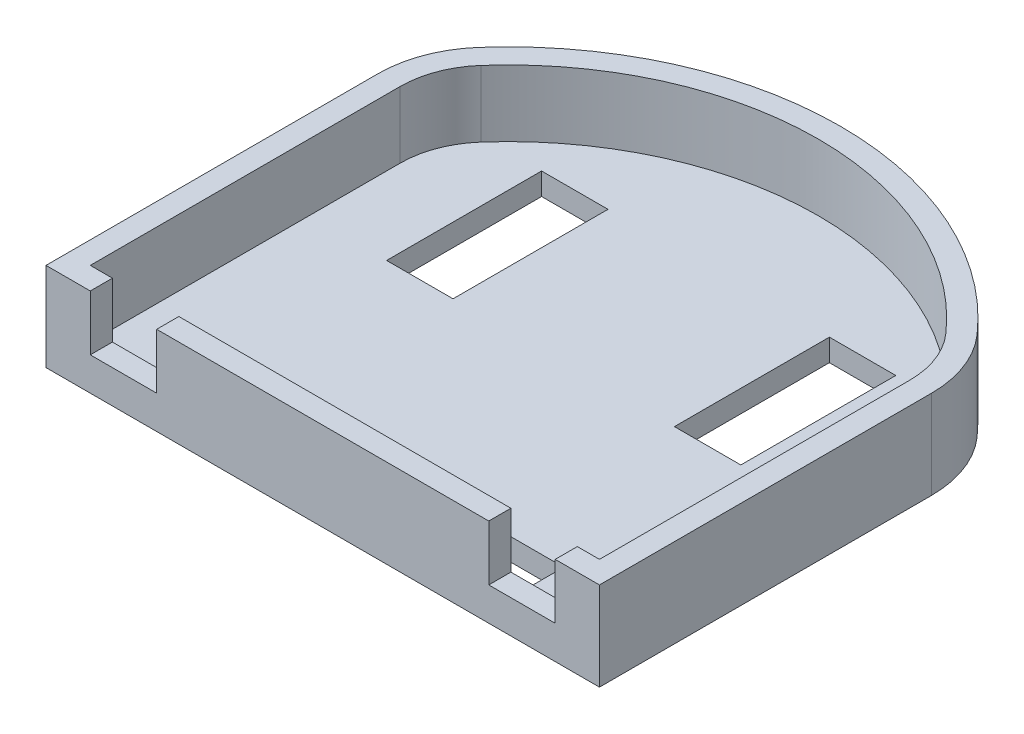
ISO-10303-21;
HEADER;
FILE_DESCRIPTION(('STEP AP214'),'2;1');
FILE_NAME('part.step','',(''),(''),'','','');
FILE_SCHEMA(('AUTOMOTIVE_DESIGN { 1 0 10303 214 1 1 1 1 }'));
ENDSEC;
DATA;
#1=APPLICATION_CONTEXT('core data for automotive mechanical design processes');
#2=APPLICATION_PROTOCOL_DEFINITION('international standard','automotive_design',2000,#1);
#3=PRODUCT_CONTEXT('',#1,'mechanical');
#4=PRODUCT('Part','Part','',(#3));
#5=PRODUCT_RELATED_PRODUCT_CATEGORY('part','',(#4));
#6=PRODUCT_DEFINITION_FORMATION('','',#4);
#7=PRODUCT_DEFINITION_CONTEXT('part definition',#1,'design');
#8=PRODUCT_DEFINITION('design','',#6,#7);
#9=PRODUCT_DEFINITION_SHAPE('','',#8);
#10=(LENGTH_UNIT() NAMED_UNIT(*) SI_UNIT(.MILLI.,.METRE.));
#11=(NAMED_UNIT(*) PLANE_ANGLE_UNIT() SI_UNIT($,.RADIAN.));
#12=(NAMED_UNIT(*) SI_UNIT($,.STERADIAN.) SOLID_ANGLE_UNIT());
#13=UNCERTAINTY_MEASURE_WITH_UNIT(LENGTH_MEASURE(1.E-05),#10,'distance_accuracy_value','');
#14=(GEOMETRIC_REPRESENTATION_CONTEXT(3) GLOBAL_UNCERTAINTY_ASSIGNED_CONTEXT((#13)) GLOBAL_UNIT_ASSIGNED_CONTEXT((#10,
#11,#12)) REPRESENTATION_CONTEXT('',''));
#15=CARTESIAN_POINT('',(0.,0.,0.));
#16=DIRECTION('',(0.,0.,1.));
#17=DIRECTION('',(1.,0.,0.));
#18=AXIS2_PLACEMENT_3D('',#15,#16,#17);
#19=CARTESIAN_POINT('',(75.,40.,-66.1437827766148));
#20=DIRECTION('',(0.,1.,0.));
#21=DIRECTION('',(0.,0.,1.));
#22=AXIS2_PLACEMENT_3D('',#19,#20,#21);
#23=PLANE('',#22);
#24=DIRECTION('',(0.,0.,-1.));
#25=VECTOR('',#24,1.);
#26=CARTESIAN_POINT('',(-105.,40.,-150.001));
#27=LINE('',#26,#25);
#28=CARTESIAN_POINT('',(-105.,40.,83.8562172233852));
#29=VERTEX_POINT('',#28);
#30=CARTESIAN_POINT('',(-105.,40.,73.8562172233852));
#31=VERTEX_POINT('',#30);
#32=EDGE_CURVE('E257',#29,#31,#27,.T.);
#33=ORIENTED_EDGE('',*,*,#32,.T.);
#34=DIRECTION('',(1.,0.,0.));
#35=VECTOR('',#34,1.);
#36=CARTESIAN_POINT('',(125.,40.,73.8562172233852));
#37=LINE('',#36,#35);
#38=CARTESIAN_POINT('',(-115.,40.,73.8562172233852));
#39=VERTEX_POINT('',#38);
#40=EDGE_CURVE('E271',#39,#31,#37,.T.);
#41=ORIENTED_EDGE('',*,*,#40,.F.);
#42=DIRECTION('',(0.,0.,1.));
#43=VECTOR('',#42,1.);
#44=CARTESIAN_POINT('',(-115.,40.,-66.1437827766147));
#45=LINE('',#44,#43);
#46=CARTESIAN_POINT('',(-115.,40.,-66.1437827766147));
#47=VERTEX_POINT('',#46);
#48=EDGE_CURVE('E294',#47,#39,#45,.T.);
#49=ORIENTED_EDGE('',*,*,#48,.F.);
#50=CARTESIAN_POINT('',(-75.,40.,-66.1437827766148));
#51=DIRECTION('',(0.,1.,0.));
#52=DIRECTION('',(0.,0.,1.));
#53=AXIS2_PLACEMENT_3D('',#50,#51,#52);
#54=CIRCLE('',#53,40.);
#55=CARTESIAN_POINT('',(-105.,40.,-92.6012958872606));
#56=VERTEX_POINT('',#55);
#57=EDGE_CURVE('E299',#56,#47,#54,.T.);
#58=ORIENTED_EDGE('',*,*,#57,.F.);
#59=CARTESIAN_POINT('',(0.,40.,0.));
#60=DIRECTION('',(0.,1.,0.));
#61=DIRECTION('',(0.,0.,1.));
#62=AXIS2_PLACEMENT_3D('',#59,#60,#61);
#63=CIRCLE('',#62,140.);
#64=CARTESIAN_POINT('',(105.,40.,-92.6012958872606));
#65=VERTEX_POINT('',#64);
#66=EDGE_CURVE('E303',#65,#56,#63,.T.);
#67=ORIENTED_EDGE('',*,*,#66,.F.);
#68=CARTESIAN_POINT('',(75.,40.,-66.1437827766148));
#69=DIRECTION('',(0.,1.,0.));
#70=DIRECTION('',(0.,0.,1.));
#71=AXIS2_PLACEMENT_3D('',#68,#69,#70);
#72=CIRCLE('',#71,40.);
#73=CARTESIAN_POINT('',(115.,40.,-66.1437827766148));
#74=VERTEX_POINT('',#73);
#75=EDGE_CURVE('E308',#74,#65,#72,.T.);
#76=ORIENTED_EDGE('',*,*,#75,.F.);
#77=DIRECTION('',(0.,0.,-1.));
#78=VECTOR('',#77,1.);
#79=CARTESIAN_POINT('',(115.,40.,-66.1437827766148));
#80=LINE('',#79,#78);
#81=CARTESIAN_POINT('',(115.,40.,73.8562172233852));
#82=VERTEX_POINT('',#81);
#83=EDGE_CURVE('E283',#82,#74,#80,.T.);
#84=ORIENTED_EDGE('',*,*,#83,.F.);
#85=CARTESIAN_POINT('',(105.,40.,73.8562172233852));
#86=VERTEX_POINT('',#85);
#87=EDGE_CURVE('E286',#86,#82,#37,.T.);
#88=ORIENTED_EDGE('',*,*,#87,.F.);
#89=DIRECTION('',(0.,0.,1.));
#90=VECTOR('',#89,1.);
#91=CARTESIAN_POINT('',(105.,40.,-150.001));
#92=LINE('',#91,#90);
#93=CARTESIAN_POINT('',(105.,40.,83.8562172233852));
#94=VERTEX_POINT('',#93);
#95=EDGE_CURVE('E58',#86,#94,#92,.T.);
#96=ORIENTED_EDGE('',*,*,#95,.T.);
#97=DIRECTION('',(1.,0.,0.));
#98=VECTOR('',#97,1.);
#99=CARTESIAN_POINT('',(125.,40.,83.8562172233852));
#100=LINE('',#99,#98);
#101=CARTESIAN_POINT('',(125.,40.,83.8562172233852));
#102=VERTEX_POINT('',#101);
#103=EDGE_CURVE('E549',#94,#102,#100,.T.);
#104=ORIENTED_EDGE('',*,*,#103,.T.);
#105=DIRECTION('',(0.,0.,-1.));
#106=VECTOR('',#105,1.);
#107=CARTESIAN_POINT('',(125.,40.,-66.1437827766148));
#108=LINE('',#107,#106);
#109=CARTESIAN_POINT('',(125.,40.,-66.1437827766148));
#110=VERTEX_POINT('',#109);
#111=EDGE_CURVE('E553',#102,#110,#108,.T.);
#112=ORIENTED_EDGE('',*,*,#111,.T.);
#113=CARTESIAN_POINT('',(75.,40.,-66.1437827766148));
#114=DIRECTION('',(0.,1.,0.));
#115=DIRECTION('',(0.,0.,1.));
#116=AXIS2_PLACEMENT_3D('',#113,#114,#115);
#117=CIRCLE('',#116,50.);
#118=CARTESIAN_POINT('',(112.5,40.,-99.2156741649221));
#119=VERTEX_POINT('',#118);
#120=EDGE_CURVE('E579',#110,#119,#117,.T.);
#121=ORIENTED_EDGE('',*,*,#120,.T.);
#122=CARTESIAN_POINT('',(0.,40.,0.));
#123=DIRECTION('',(0.,1.,0.));
#124=DIRECTION('',(0.,0.,1.));
#125=AXIS2_PLACEMENT_3D('',#122,#123,#124);
#126=CIRCLE('',#125,150.);
#127=CARTESIAN_POINT('',(-112.5,40.,-99.2156741649221));
#128=VERTEX_POINT('',#127);
#129=EDGE_CURVE('E661',#119,#128,#126,.T.);
#130=ORIENTED_EDGE('',*,*,#129,.T.);
#131=CARTESIAN_POINT('',(-75.,40.,-66.1437827766148));
#132=DIRECTION('',(0.,1.,0.));
#133=DIRECTION('',(0.,0.,-1.));
#134=AXIS2_PLACEMENT_3D('',#131,#132,#133);
#135=CIRCLE('',#134,50.);
#136=CARTESIAN_POINT('',(-125.,40.,-66.1437827766147));
#137=VERTEX_POINT('',#136);
#138=EDGE_CURVE('E602',#128,#137,#135,.T.);
#139=ORIENTED_EDGE('',*,*,#138,.T.);
#140=DIRECTION('',(0.,0.,1.));
#141=VECTOR('',#140,1.);
#142=CARTESIAN_POINT('',(-125.,40.,-66.1437827766147));
#143=LINE('',#142,#141);
#144=CARTESIAN_POINT('',(-125.,40.,83.8562172233852));
#145=VERTEX_POINT('',#144);
#146=EDGE_CURVE('E554',#137,#145,#143,.T.);
#147=ORIENTED_EDGE('',*,*,#146,.T.);
#148=EDGE_CURVE('E273',#145,#29,#100,.T.);
#149=ORIENTED_EDGE('',*,*,#148,.T.);
#150=EDGE_LOOP('',(#33,#41,#49,#58,#67,#76,#84,#88,#96,#104,#112,#121,#130,#139,#147,#149));
#151=FACE_BOUND('',#150,.T.);
#152=ADVANCED_FACE('F42',(#151),#23,.T.);
#153=CARTESIAN_POINT('',(75.,40.,-66.1437827766148));
#154=DIRECTION('',(0.,-1.,0.));
#155=DIRECTION('',(0.,0.,-1.));
#156=AXIS2_PLACEMENT_3D('',#153,#154,#155);
#157=CYLINDRICAL_SURFACE('',#156,50.);
#158=CARTESIAN_POINT('',(75.,0.,-66.1437827766148));
#159=DIRECTION('',(0.,1.,0.));
#160=DIRECTION('',(0.,0.,1.));
#161=AXIS2_PLACEMENT_3D('',#158,#159,#160);
#162=CIRCLE('',#161,50.);
#163=CARTESIAN_POINT('',(125.,0.,-66.1437827766148));
#164=VERTEX_POINT('',#163);
#165=CARTESIAN_POINT('',(112.5,0.,-99.2156741649221));
#166=VERTEX_POINT('',#165);
#167=EDGE_CURVE('E347',#164,#166,#162,.T.);
#168=ORIENTED_EDGE('',*,*,#167,.T.);
#169=DIRECTION('',(0.,-1.,0.));
#170=VECTOR('',#169,1.);
#171=CARTESIAN_POINT('',(112.5,40.,-99.2156741649221));
#172=LINE('',#171,#170);
#173=EDGE_CURVE('E11',#119,#166,#172,.T.);
#174=ORIENTED_EDGE('',*,*,#173,.F.);
#175=ORIENTED_EDGE('',*,*,#120,.F.);
#176=DIRECTION('',(0.,-1.,0.));
#177=VECTOR('',#176,1.);
#178=CARTESIAN_POINT('',(125.,40.,-66.1437827766148));
#179=LINE('',#178,#177);
#180=EDGE_CURVE('E560',#110,#164,#179,.T.);
#181=ORIENTED_EDGE('',*,*,#180,.T.);
#182=EDGE_LOOP('',(#168,#174,#175,#181));
#183=FACE_BOUND('',#182,.T.);
#184=ADVANCED_FACE('F44',(#183),#157,.T.);
#185=CARTESIAN_POINT('',(0.,40.,0.));
#186=DIRECTION('',(0.,-1.,0.));
#187=DIRECTION('',(0.,0.,-1.));
#188=AXIS2_PLACEMENT_3D('',#185,#186,#187);
#189=CYLINDRICAL_SURFACE('',#188,150.);
#190=CARTESIAN_POINT('',(0.,0.,0.));
#191=DIRECTION('',(0.,1.,0.));
#192=DIRECTION('',(0.,0.,1.));
#193=AXIS2_PLACEMENT_3D('',#190,#191,#192);
#194=CIRCLE('',#193,150.);
#195=CARTESIAN_POINT('',(-112.5,0.,-99.2156741649221));
#196=VERTEX_POINT('',#195);
#197=EDGE_CURVE('E564',#166,#196,#194,.T.);
#198=ORIENTED_EDGE('',*,*,#197,.T.);
#199=DIRECTION('',(0.,-1.,0.));
#200=VECTOR('',#199,1.);
#201=CARTESIAN_POINT('',(-112.5,40.,-99.2156741649221));
#202=LINE('',#201,#200);
#203=EDGE_CURVE('E51',#128,#196,#202,.T.);
#204=ORIENTED_EDGE('',*,*,#203,.F.);
#205=ORIENTED_EDGE('',*,*,#129,.F.);
#206=ORIENTED_EDGE('',*,*,#173,.T.);
#207=EDGE_LOOP('',(#198,#204,#205,#206));
#208=FACE_BOUND('',#207,.T.);
#209=ADVANCED_FACE('F634',(#208),#189,.T.);
#210=CARTESIAN_POINT('',(-75.,40.,-66.1437827766148));
#211=DIRECTION('',(0.,-1.,0.));
#212=DIRECTION('',(0.,0.,-1.));
#213=AXIS2_PLACEMENT_3D('',#210,#211,#212);
#214=CYLINDRICAL_SURFACE('',#213,50.);
#215=CARTESIAN_POINT('',(-75.,0.,-66.1437827766148));
#216=DIRECTION('',(0.,1.,0.));
#217=DIRECTION('',(0.,0.,-1.));
#218=AXIS2_PLACEMENT_3D('',#215,#216,#217);
#219=CIRCLE('',#218,50.);
#220=CARTESIAN_POINT('',(-125.,0.,-66.1437827766147));
#221=VERTEX_POINT('',#220);
#222=EDGE_CURVE('E567',#196,#221,#219,.T.);
#223=ORIENTED_EDGE('',*,*,#222,.T.);
#224=DIRECTION('',(0.,-1.,0.));
#225=VECTOR('',#224,1.);
#226=CARTESIAN_POINT('',(-125.,40.,-66.1437827766147));
#227=LINE('',#226,#225);
#228=EDGE_CURVE('E591',#137,#221,#227,.T.);
#229=ORIENTED_EDGE('',*,*,#228,.F.);
#230=ORIENTED_EDGE('',*,*,#138,.F.);
#231=ORIENTED_EDGE('',*,*,#203,.T.);
#232=EDGE_LOOP('',(#223,#229,#230,#231));
#233=FACE_BOUND('',#232,.T.);
#234=ADVANCED_FACE('F600',(#233),#214,.T.);
#235=CARTESIAN_POINT('',(-125.,40.,-66.1437827766147));
#236=DIRECTION('',(1.,0.,0.));
#237=DIRECTION('',(0.,0.,-1.));
#238=AXIS2_PLACEMENT_3D('',#235,#236,#237);
#239=PLANE('',#238);
#240=DIRECTION('',(0.,0.,1.));
#241=VECTOR('',#240,1.);
#242=CARTESIAN_POINT('',(-125.,0.,-66.1437827766147));
#243=LINE('',#242,#241);
#244=CARTESIAN_POINT('',(-125.,0.,83.8562172233852));
#245=VERTEX_POINT('',#244);
#246=EDGE_CURVE('E570',#221,#245,#243,.T.);
#247=ORIENTED_EDGE('',*,*,#246,.T.);
#248=DIRECTION('',(0.,-1.,0.));
#249=VECTOR('',#248,1.);
#250=CARTESIAN_POINT('',(-125.,40.,83.8562172233852));
#251=LINE('',#250,#249);
#252=EDGE_CURVE('E587',#145,#245,#251,.T.);
#253=ORIENTED_EDGE('',*,*,#252,.F.);
#254=ORIENTED_EDGE('',*,*,#146,.F.);
#255=ORIENTED_EDGE('',*,*,#228,.T.);
#256=EDGE_LOOP('',(#247,#253,#254,#255));
#257=FACE_BOUND('',#256,.T.);
#258=ADVANCED_FACE('F612',(#257),#239,.F.);
#259=CARTESIAN_POINT('',(125.,40.,83.8562172233852));
#260=DIRECTION('',(0.,0.,-1.));
#261=DIRECTION('',(-1.,0.,0.));
#262=AXIS2_PLACEMENT_3D('',#259,#260,#261);
#263=PLANE('',#262);
#264=DIRECTION('',(1.,0.,0.));
#265=VECTOR('',#264,1.);
#266=CARTESIAN_POINT('',(-105.,15.,83.8562172233852));
#267=LINE('',#266,#265);
#268=CARTESIAN_POINT('',(-105.,15.,83.8562172233852));
#269=VERTEX_POINT('',#268);
#270=CARTESIAN_POINT('',(-75.,15.,83.8562172233852));
#271=VERTEX_POINT('',#270);
#272=EDGE_CURVE('E517',#269,#271,#267,.T.);
#273=ORIENTED_EDGE('',*,*,#272,.F.);
#274=DIRECTION('',(0.,-1.,0.));
#275=VECTOR('',#274,1.);
#276=CARTESIAN_POINT('',(-105.,65.,83.8562172233852));
#277=LINE('',#276,#275);
#278=EDGE_CURVE('E523',#29,#269,#277,.T.);
#279=ORIENTED_EDGE('',*,*,#278,.F.);
#280=ORIENTED_EDGE('',*,*,#148,.F.);
#281=ORIENTED_EDGE('',*,*,#252,.T.);
#282=DIRECTION('',(1.,0.,0.));
#283=VECTOR('',#282,1.);
#284=CARTESIAN_POINT('',(125.,0.,83.8562172233852));
#285=LINE('',#284,#283);
#286=CARTESIAN_POINT('',(125.,0.,83.8562172233852));
#287=VERTEX_POINT('',#286);
#288=EDGE_CURVE('E573',#245,#287,#285,.T.);
#289=ORIENTED_EDGE('',*,*,#288,.T.);
#290=DIRECTION('',(0.,-1.,0.));
#291=VECTOR('',#290,1.);
#292=CARTESIAN_POINT('',(125.,40.,83.8562172233852));
#293=LINE('',#292,#291);
#294=EDGE_CURVE('E583',#102,#287,#293,.T.);
#295=ORIENTED_EDGE('',*,*,#294,.F.);
#296=ORIENTED_EDGE('',*,*,#103,.F.);
#297=DIRECTION('',(0.,1.,0.));
#298=VECTOR('',#297,1.);
#299=CARTESIAN_POINT('',(105.,65.,83.8562172233852));
#300=LINE('',#299,#298);
#301=CARTESIAN_POINT('',(105.,15.,83.8562172233852));
#302=VERTEX_POINT('',#301);
#303=EDGE_CURVE('E494',#302,#94,#300,.T.);
#304=ORIENTED_EDGE('',*,*,#303,.F.);
#305=DIRECTION('',(1.,0.,0.));
#306=VECTOR('',#305,1.);
#307=CARTESIAN_POINT('',(105.,15.,83.8562172233852));
#308=LINE('',#307,#306);
#309=CARTESIAN_POINT('',(75.,15.,83.8562172233852));
#310=VERTEX_POINT('',#309);
#311=EDGE_CURVE('E501',#310,#302,#308,.T.);
#312=ORIENTED_EDGE('',*,*,#311,.F.);
#313=DIRECTION('',(0.,-1.,0.));
#314=VECTOR('',#313,1.);
#315=CARTESIAN_POINT('',(75.,65.,83.8562172233852));
#316=LINE('',#315,#314);
#317=CARTESIAN_POINT('',(75.,40.,83.8562172233852));
#318=VERTEX_POINT('',#317);
#319=EDGE_CURVE('E497',#318,#310,#316,.T.);
#320=ORIENTED_EDGE('',*,*,#319,.F.);
#321=CARTESIAN_POINT('',(-75.,40.,83.8562172233852));
#322=VERTEX_POINT('',#321);
#323=EDGE_CURVE('E541',#322,#318,#100,.T.);
#324=ORIENTED_EDGE('',*,*,#323,.F.);
#325=DIRECTION('',(0.,1.,0.));
#326=VECTOR('',#325,1.);
#327=CARTESIAN_POINT('',(-75.,65.,83.8562172233852));
#328=LINE('',#327,#326);
#329=EDGE_CURVE('E526',#271,#322,#328,.T.);
#330=ORIENTED_EDGE('',*,*,#329,.F.);
#331=EDGE_LOOP('',(#273,#279,#280,#281,#289,#295,#296,#304,#312,#320,#324,#330));
#332=FACE_BOUND('',#331,.T.);
#333=ADVANCED_FACE('F546',(#332),#263,.F.);
#334=CARTESIAN_POINT('',(125.,40.,-66.1437827766148));
#335=DIRECTION('',(-1.,0.,0.));
#336=DIRECTION('',(0.,0.,1.));
#337=AXIS2_PLACEMENT_3D('',#334,#335,#336);
#338=PLANE('',#337);
#339=DIRECTION('',(0.,0.,-1.));
#340=VECTOR('',#339,1.);
#341=CARTESIAN_POINT('',(125.,0.,-66.1437827766148));
#342=LINE('',#341,#340);
#343=EDGE_CURVE('E576',#287,#164,#342,.T.);
#344=ORIENTED_EDGE('',*,*,#343,.T.);
#345=ORIENTED_EDGE('',*,*,#180,.F.);
#346=ORIENTED_EDGE('',*,*,#111,.F.);
#347=ORIENTED_EDGE('',*,*,#294,.T.);
#348=EDGE_LOOP('',(#344,#345,#346,#347));
#349=FACE_BOUND('',#348,.T.);
#350=ADVANCED_FACE('F639',(#349),#338,.F.);
#351=DIRECTION('',(0.,0.,1.));
#352=VECTOR('',#351,1.);
#353=CARTESIAN_POINT('',(-75.,40.,-150.001));
#354=LINE('',#353,#352);
#355=CARTESIAN_POINT('',(-75.,40.,73.8562172233852));
#356=VERTEX_POINT('',#355);
#357=EDGE_CURVE('E66',#356,#322,#354,.T.);
#358=ORIENTED_EDGE('',*,*,#357,.T.);
#359=ORIENTED_EDGE('',*,*,#323,.T.);
#360=DIRECTION('',(0.,0.,-1.));
#361=VECTOR('',#360,1.);
#362=CARTESIAN_POINT('',(75.,40.,-150.001));
#363=LINE('',#362,#361);
#364=CARTESIAN_POINT('',(75.,40.,73.8562172233852));
#365=VERTEX_POINT('',#364);
#366=EDGE_CURVE('E275',#318,#365,#363,.T.);
#367=ORIENTED_EDGE('',*,*,#366,.T.);
#368=EDGE_CURVE('E284',#356,#365,#37,.T.);
#369=ORIENTED_EDGE('',*,*,#368,.F.);
#370=EDGE_LOOP('',(#358,#359,#367,#369));
#371=FACE_BOUND('',#370,.T.);
#372=ADVANCED_FACE('F540',(#371),#23,.T.);
#373=CARTESIAN_POINT('',(75.,0.,-66.1437827766148));
#374=DIRECTION('',(0.,1.,0.));
#375=DIRECTION('',(0.,0.,1.));
#376=AXIS2_PLACEMENT_3D('',#373,#374,#375);
#377=PLANE('',#376);
#378=DIRECTION('',(1.,0.,0.));
#379=VECTOR('',#378,1.);
#380=CARTESIAN_POINT('',(-80.,0.,70.));
#381=LINE('',#380,#379);
#382=CARTESIAN_POINT('',(-80.,0.,70.));
#383=VERTEX_POINT('',#382);
#384=CARTESIAN_POINT('',(80.,0.,70.));
#385=VERTEX_POINT('',#384);
#386=EDGE_CURVE('E409',#383,#385,#381,.T.);
#387=ORIENTED_EDGE('',*,*,#386,.T.);
#388=DIRECTION('',(0.,0.,-1.));
#389=VECTOR('',#388,1.);
#390=CARTESIAN_POINT('',(80.,0.,70.));
#391=LINE('',#390,#389);
#392=CARTESIAN_POINT('',(80.,0.,55.));
#393=VERTEX_POINT('',#392);
#394=EDGE_CURVE('E396',#385,#393,#391,.T.);
#395=ORIENTED_EDGE('',*,*,#394,.T.);
#396=DIRECTION('',(-1.,0.,0.));
#397=VECTOR('',#396,1.);
#398=CARTESIAN_POINT('',(-80.,0.,55.));
#399=LINE('',#398,#397);
#400=CARTESIAN_POINT('',(-80.,0.,55.));
#401=VERTEX_POINT('',#400);
#402=EDGE_CURVE('E401',#393,#401,#399,.T.);
#403=ORIENTED_EDGE('',*,*,#402,.T.);
#404=DIRECTION('',(0.,0.,1.));
#405=VECTOR('',#404,1.);
#406=CARTESIAN_POINT('',(-80.,0.,70.));
#407=LINE('',#406,#405);
#408=EDGE_CURVE('E405',#401,#383,#407,.T.);
#409=ORIENTED_EDGE('',*,*,#408,.T.);
#410=EDGE_LOOP('',(#387,#395,#403,#409));
#411=FACE_BOUND('',#410,.T.);
#412=DIRECTION('',(0.,0.,-1.));
#413=VECTOR('',#412,1.);
#414=CARTESIAN_POINT('',(-50.,0.,-95.));
#415=LINE('',#414,#413);
#416=CARTESIAN_POINT('',(-50.,0.,-25.));
#417=VERTEX_POINT('',#416);
#418=CARTESIAN_POINT('',(-50.,0.,-95.));
#419=VERTEX_POINT('',#418);
#420=EDGE_CURVE('E453',#417,#419,#415,.T.);
#421=ORIENTED_EDGE('',*,*,#420,.T.);
#422=DIRECTION('',(-1.,0.,0.));
#423=VECTOR('',#422,1.);
#424=CARTESIAN_POINT('',(-50.,0.,-95.));
#425=LINE('',#424,#423);
#426=CARTESIAN_POINT('',(-80.,0.,-95.));
#427=VERTEX_POINT('',#426);
#428=EDGE_CURVE('E440',#419,#427,#425,.T.);
#429=ORIENTED_EDGE('',*,*,#428,.T.);
#430=DIRECTION('',(0.,0.,1.));
#431=VECTOR('',#430,1.);
#432=CARTESIAN_POINT('',(-80.,0.,-95.));
#433=LINE('',#432,#431);
#434=CARTESIAN_POINT('',(-80.,0.,-25.));
#435=VERTEX_POINT('',#434);
#436=EDGE_CURVE('E445',#427,#435,#433,.T.);
#437=ORIENTED_EDGE('',*,*,#436,.T.);
#438=DIRECTION('',(1.,0.,0.));
#439=VECTOR('',#438,1.);
#440=CARTESIAN_POINT('',(-50.,0.,-25.));
#441=LINE('',#440,#439);
#442=EDGE_CURVE('E449',#435,#417,#441,.T.);
#443=ORIENTED_EDGE('',*,*,#442,.T.);
#444=EDGE_LOOP('',(#421,#429,#437,#443));
#445=FACE_BOUND('',#444,.T.);
#446=DIRECTION('',(1.,0.,0.));
#447=VECTOR('',#446,1.);
#448=CARTESIAN_POINT('',(50.,0.,-25.));
#449=LINE('',#448,#447);
#450=CARTESIAN_POINT('',(50.,0.,-25.));
#451=VERTEX_POINT('',#450);
#452=CARTESIAN_POINT('',(80.,0.,-25.));
#453=VERTEX_POINT('',#452);
#454=EDGE_CURVE('E357',#451,#453,#449,.T.);
#455=ORIENTED_EDGE('',*,*,#454,.T.);
#456=DIRECTION('',(0.,0.,-1.));
#457=VECTOR('',#456,1.);
#458=CARTESIAN_POINT('',(80.,0.,-95.));
#459=LINE('',#458,#457);
#460=CARTESIAN_POINT('',(80.,0.,-95.));
#461=VERTEX_POINT('',#460);
#462=EDGE_CURVE('E369',#453,#461,#459,.T.);
#463=ORIENTED_EDGE('',*,*,#462,.T.);
#464=DIRECTION('',(-1.,0.,0.));
#465=VECTOR('',#464,1.);
#466=CARTESIAN_POINT('',(50.,0.,-95.));
#467=LINE('',#466,#465);
#468=CARTESIAN_POINT('',(50.,0.,-95.));
#469=VERTEX_POINT('',#468);
#470=EDGE_CURVE('E389',#461,#469,#467,.T.);
#471=ORIENTED_EDGE('',*,*,#470,.T.);
#472=DIRECTION('',(0.,0.,1.));
#473=VECTOR('',#472,1.);
#474=CARTESIAN_POINT('',(50.,0.,-95.));
#475=LINE('',#474,#473);
#476=EDGE_CURVE('E385',#469,#451,#475,.T.);
#477=ORIENTED_EDGE('',*,*,#476,.T.);
#478=EDGE_LOOP('',(#455,#463,#471,#477));
#479=FACE_BOUND('',#478,.T.);
#480=ORIENTED_EDGE('',*,*,#167,.F.);
#481=ORIENTED_EDGE('',*,*,#343,.F.);
#482=ORIENTED_EDGE('',*,*,#288,.F.);
#483=ORIENTED_EDGE('',*,*,#246,.F.);
#484=ORIENTED_EDGE('',*,*,#222,.F.);
#485=ORIENTED_EDGE('',*,*,#197,.F.);
#486=EDGE_LOOP('',(#480,#481,#482,#483,#484,#485));
#487=FACE_BOUND('',#486,.T.);
#488=ADVANCED_FACE('F607',(#411,#445,#479,#487),#377,.F.);
#489=CARTESIAN_POINT('',(75.,40.,-66.1437827766148));
#490=DIRECTION('',(0.,-1.,0.));
#491=DIRECTION('',(0.,0.,-1.));
#492=AXIS2_PLACEMENT_3D('',#489,#490,#491);
#493=CYLINDRICAL_SURFACE('',#492,40.);
#494=CARTESIAN_POINT('',(75.,10.,-66.1437827766148));
#495=DIRECTION('',(0.,1.,0.));
#496=DIRECTION('',(0.,0.,1.));
#497=AXIS2_PLACEMENT_3D('',#494,#495,#496);
#498=CIRCLE('',#497,40.);
#499=CARTESIAN_POINT('',(115.,10.,-66.1437827766148));
#500=VERTEX_POINT('',#499);
#501=CARTESIAN_POINT('',(105.,10.,-92.6012958872606));
#502=VERTEX_POINT('',#501);
#503=EDGE_CURVE('E340',#500,#502,#498,.T.);
#504=ORIENTED_EDGE('',*,*,#503,.F.);
#505=DIRECTION('',(0.,-1.,0.));
#506=VECTOR('',#505,1.);
#507=CARTESIAN_POINT('',(115.,40.,-66.1437827766148));
#508=LINE('',#507,#506);
#509=EDGE_CURVE('E289',#74,#500,#508,.T.);
#510=ORIENTED_EDGE('',*,*,#509,.F.);
#511=ORIENTED_EDGE('',*,*,#75,.T.);
#512=DIRECTION('',(0.,-1.,0.));
#513=VECTOR('',#512,1.);
#514=CARTESIAN_POINT('',(105.,40.,-92.6012958872606));
#515=LINE('',#514,#513);
#516=EDGE_CURVE('E337',#65,#502,#515,.T.);
#517=ORIENTED_EDGE('',*,*,#516,.T.);
#518=EDGE_LOOP('',(#504,#510,#511,#517));
#519=FACE_BOUND('',#518,.T.);
#520=ADVANCED_FACE('F644',(#519),#493,.F.);
#521=CARTESIAN_POINT('',(0.,40.,0.));
#522=DIRECTION('',(0.,-1.,0.));
#523=DIRECTION('',(0.,0.,-1.));
#524=AXIS2_PLACEMENT_3D('',#521,#522,#523);
#525=CYLINDRICAL_SURFACE('',#524,140.);
#526=CARTESIAN_POINT('',(0.,10.,0.));
#527=DIRECTION('',(0.,1.,0.));
#528=DIRECTION('',(0.,0.,1.));
#529=AXIS2_PLACEMENT_3D('',#526,#527,#528);
#530=CIRCLE('',#529,140.);
#531=CARTESIAN_POINT('',(-105.,10.,-92.6012958872606));
#532=VERTEX_POINT('',#531);
#533=EDGE_CURVE('E333',#502,#532,#530,.T.);
#534=ORIENTED_EDGE('',*,*,#533,.F.);
#535=ORIENTED_EDGE('',*,*,#516,.F.);
#536=ORIENTED_EDGE('',*,*,#66,.T.);
#537=DIRECTION('',(0.,-1.,0.));
#538=VECTOR('',#537,1.);
#539=CARTESIAN_POINT('',(-105.,40.,-92.6012958872606));
#540=LINE('',#539,#538);
#541=EDGE_CURVE('E330',#56,#532,#540,.T.);
#542=ORIENTED_EDGE('',*,*,#541,.T.);
#543=EDGE_LOOP('',(#534,#535,#536,#542));
#544=FACE_BOUND('',#543,.T.);
#545=ADVANCED_FACE('F691',(#544),#525,.F.);
#546=CARTESIAN_POINT('',(-75.,40.,-66.1437827766148));
#547=DIRECTION('',(0.,-1.,0.));
#548=DIRECTION('',(0.,0.,-1.));
#549=AXIS2_PLACEMENT_3D('',#546,#547,#548);
#550=CYLINDRICAL_SURFACE('',#549,40.);
#551=CARTESIAN_POINT('',(-75.,10.,-66.1437827766148));
#552=DIRECTION('',(0.,1.,0.));
#553=DIRECTION('',(0.,0.,1.));
#554=AXIS2_PLACEMENT_3D('',#551,#552,#553);
#555=CIRCLE('',#554,40.);
#556=CARTESIAN_POINT('',(-115.,10.,-66.1437827766147));
#557=VERTEX_POINT('',#556);
#558=EDGE_CURVE('E326',#532,#557,#555,.T.);
#559=ORIENTED_EDGE('',*,*,#558,.F.);
#560=ORIENTED_EDGE('',*,*,#541,.F.);
#561=ORIENTED_EDGE('',*,*,#57,.T.);
#562=DIRECTION('',(0.,1.,0.));
#563=VECTOR('',#562,1.);
#564=CARTESIAN_POINT('',(-115.,40.,-66.1437827766147));
#565=LINE('',#564,#563);
#566=EDGE_CURVE('E323',#47,#557,#565,.F.);
#567=ORIENTED_EDGE('',*,*,#566,.T.);
#568=EDGE_LOOP('',(#559,#560,#561,#567));
#569=FACE_BOUND('',#568,.T.);
#570=ADVANCED_FACE('F684',(#569),#550,.F.);
#571=CARTESIAN_POINT('',(-115.,40.,-66.1437827766147));
#572=DIRECTION('',(1.,0.,0.));
#573=DIRECTION('',(0.,0.,-1.));
#574=AXIS2_PLACEMENT_3D('',#571,#572,#573);
#575=PLANE('',#574);
#576=DIRECTION('',(0.,0.,1.));
#577=VECTOR('',#576,1.);
#578=CARTESIAN_POINT('',(-115.,10.,-66.1437827766147));
#579=LINE('',#578,#577);
#580=CARTESIAN_POINT('',(-115.,10.,73.8562172233852));
#581=VERTEX_POINT('',#580);
#582=EDGE_CURVE('E320',#557,#581,#579,.T.);
#583=ORIENTED_EDGE('',*,*,#582,.F.);
#584=ORIENTED_EDGE('',*,*,#566,.F.);
#585=ORIENTED_EDGE('',*,*,#48,.T.);
#586=DIRECTION('',(0.,-1.,0.));
#587=VECTOR('',#586,1.);
#588=CARTESIAN_POINT('',(-115.,40.,73.8562172233852));
#589=LINE('',#588,#587);
#590=EDGE_CURVE('E281',#39,#581,#589,.T.);
#591=ORIENTED_EDGE('',*,*,#590,.T.);
#592=EDGE_LOOP('',(#583,#584,#585,#591));
#593=FACE_BOUND('',#592,.T.);
#594=ADVANCED_FACE('F682',(#593),#575,.T.);
#595=CARTESIAN_POINT('',(125.,40.,73.8562172233852));
#596=DIRECTION('',(0.,0.,-1.));
#597=DIRECTION('',(-1.,0.,0.));
#598=AXIS2_PLACEMENT_3D('',#595,#596,#597);
#599=PLANE('',#598);
#600=DIRECTION('',(0.,-1.,0.));
#601=VECTOR('',#600,1.);
#602=CARTESIAN_POINT('',(-105.,65.,73.8562172233852));
#603=LINE('',#602,#601);
#604=CARTESIAN_POINT('',(-105.,15.,73.8562172233852));
#605=VERTEX_POINT('',#604);
#606=EDGE_CURVE('E253',#31,#605,#603,.T.);
#607=ORIENTED_EDGE('',*,*,#606,.T.);
#608=DIRECTION('',(1.,0.,0.));
#609=VECTOR('',#608,1.);
#610=CARTESIAN_POINT('',(-105.,15.,73.8562172233852));
#611=LINE('',#610,#609);
#612=CARTESIAN_POINT('',(-75.,15.,73.8562172233852));
#613=VERTEX_POINT('',#612);
#614=EDGE_CURVE('E532',#605,#613,#611,.T.);
#615=ORIENTED_EDGE('',*,*,#614,.T.);
#616=DIRECTION('',(0.,1.,0.));
#617=VECTOR('',#616,1.);
#618=CARTESIAN_POINT('',(-75.,65.,73.8562172233852));
#619=LINE('',#618,#617);
#620=EDGE_CURVE('E529',#613,#356,#619,.T.);
#621=ORIENTED_EDGE('',*,*,#620,.T.);
#622=ORIENTED_EDGE('',*,*,#368,.T.);
#623=DIRECTION('',(0.,-1.,0.));
#624=VECTOR('',#623,1.);
#625=CARTESIAN_POINT('',(75.,65.,73.8562172233852));
#626=LINE('',#625,#624);
#627=CARTESIAN_POINT('',(75.,15.,73.8562172233852));
#628=VERTEX_POINT('',#627);
#629=EDGE_CURVE('E509',#365,#628,#626,.T.);
#630=ORIENTED_EDGE('',*,*,#629,.T.);
#631=DIRECTION('',(1.,0.,0.));
#632=VECTOR('',#631,1.);
#633=CARTESIAN_POINT('',(105.,15.,73.8562172233852));
#634=LINE('',#633,#632);
#635=CARTESIAN_POINT('',(105.,15.,73.8562172233852));
#636=VERTEX_POINT('',#635);
#637=EDGE_CURVE('E487',#628,#636,#634,.T.);
#638=ORIENTED_EDGE('',*,*,#637,.T.);
#639=DIRECTION('',(0.,1.,0.));
#640=VECTOR('',#639,1.);
#641=CARTESIAN_POINT('',(105.,65.,73.8562172233852));
#642=LINE('',#641,#640);
#643=EDGE_CURVE('E491',#636,#86,#642,.T.);
#644=ORIENTED_EDGE('',*,*,#643,.T.);
#645=ORIENTED_EDGE('',*,*,#87,.T.);
#646=DIRECTION('',(0.,-1.,0.));
#647=VECTOR('',#646,1.);
#648=CARTESIAN_POINT('',(115.,40.,73.8562172233852));
#649=LINE('',#648,#647);
#650=CARTESIAN_POINT('',(115.,10.,73.8562172233852));
#651=VERTEX_POINT('',#650);
#652=EDGE_CURVE('E315',#82,#651,#649,.T.);
#653=ORIENTED_EDGE('',*,*,#652,.T.);
#654=DIRECTION('',(1.,0.,0.));
#655=VECTOR('',#654,1.);
#656=CARTESIAN_POINT('',(125.,10.,73.8562172233852));
#657=LINE('',#656,#655);
#658=EDGE_CURVE('E314',#581,#651,#657,.T.);
#659=ORIENTED_EDGE('',*,*,#658,.F.);
#660=ORIENTED_EDGE('',*,*,#590,.F.);
#661=ORIENTED_EDGE('',*,*,#40,.T.);
#662=EDGE_LOOP('',(#607,#615,#621,#622,#630,#638,#644,#645,#653,#659,#660,#661));
#663=FACE_BOUND('',#662,.T.);
#664=ADVANCED_FACE('F278',(#663),#599,.T.);
#665=CARTESIAN_POINT('',(115.,40.,-66.1437827766148));
#666=DIRECTION('',(-1.,0.,0.));
#667=DIRECTION('',(0.,0.,1.));
#668=AXIS2_PLACEMENT_3D('',#665,#666,#667);
#669=PLANE('',#668);
#670=DIRECTION('',(0.,0.,-1.));
#671=VECTOR('',#670,1.);
#672=CARTESIAN_POINT('',(115.,10.,-66.1437827766148));
#673=LINE('',#672,#671);
#674=EDGE_CURVE('E311',#651,#500,#673,.T.);
#675=ORIENTED_EDGE('',*,*,#674,.F.);
#676=ORIENTED_EDGE('',*,*,#652,.F.);
#677=ORIENTED_EDGE('',*,*,#83,.T.);
#678=ORIENTED_EDGE('',*,*,#509,.T.);
#679=EDGE_LOOP('',(#675,#676,#677,#678));
#680=FACE_BOUND('',#679,.T.);
#681=ADVANCED_FACE('F674',(#680),#669,.T.);
#682=CARTESIAN_POINT('',(75.,10.,-66.1437827766148));
#683=DIRECTION('',(0.,1.,0.));
#684=DIRECTION('',(0.,0.,1.));
#685=AXIS2_PLACEMENT_3D('',#682,#683,#684);
#686=PLANE('',#685);
#687=DIRECTION('',(0.,0.,-1.));
#688=VECTOR('',#687,1.);
#689=CARTESIAN_POINT('',(80.,10.,70.));
#690=LINE('',#689,#688);
#691=CARTESIAN_POINT('',(80.,10.,70.));
#692=VERTEX_POINT('',#691);
#693=CARTESIAN_POINT('',(80.,10.,55.));
#694=VERTEX_POINT('',#693);
#695=EDGE_CURVE('E414',#692,#694,#690,.T.);
#696=ORIENTED_EDGE('',*,*,#695,.F.);
#697=DIRECTION('',(1.,0.,0.));
#698=VECTOR('',#697,1.);
#699=CARTESIAN_POINT('',(-80.,10.,70.));
#700=LINE('',#699,#698);
#701=CARTESIAN_POINT('',(-80.,10.,70.));
#702=VERTEX_POINT('',#701);
#703=EDGE_CURVE('E400',#702,#692,#700,.T.);
#704=ORIENTED_EDGE('',*,*,#703,.F.);
#705=DIRECTION('',(0.,0.,1.));
#706=VECTOR('',#705,1.);
#707=CARTESIAN_POINT('',(-80.,10.,70.));
#708=LINE('',#707,#706);
#709=CARTESIAN_POINT('',(-80.,10.,55.));
#710=VERTEX_POINT('',#709);
#711=EDGE_CURVE('E422',#710,#702,#708,.T.);
#712=ORIENTED_EDGE('',*,*,#711,.F.);
#713=DIRECTION('',(-1.,0.,0.));
#714=VECTOR('',#713,1.);
#715=CARTESIAN_POINT('',(-80.,10.,55.));
#716=LINE('',#715,#714);
#717=EDGE_CURVE('E418',#694,#710,#716,.T.);
#718=ORIENTED_EDGE('',*,*,#717,.F.);
#719=EDGE_LOOP('',(#696,#704,#712,#718));
#720=FACE_BOUND('',#719,.T.);
#721=DIRECTION('',(-1.,0.,0.));
#722=VECTOR('',#721,1.);
#723=CARTESIAN_POINT('',(-50.,10.,-95.));
#724=LINE('',#723,#722);
#725=CARTESIAN_POINT('',(-50.,10.,-95.));
#726=VERTEX_POINT('',#725);
#727=CARTESIAN_POINT('',(-80.,10.,-95.));
#728=VERTEX_POINT('',#727);
#729=EDGE_CURVE('E381',#726,#728,#724,.T.);
#730=ORIENTED_EDGE('',*,*,#729,.F.);
#731=DIRECTION('',(0.,0.,-1.));
#732=VECTOR('',#731,1.);
#733=CARTESIAN_POINT('',(-50.,10.,-95.));
#734=LINE('',#733,#732);
#735=CARTESIAN_POINT('',(-50.,10.,-25.));
#736=VERTEX_POINT('',#735);
#737=EDGE_CURVE('E444',#736,#726,#734,.T.);
#738=ORIENTED_EDGE('',*,*,#737,.F.);
#739=DIRECTION('',(1.,0.,0.));
#740=VECTOR('',#739,1.);
#741=CARTESIAN_POINT('',(-50.,10.,-25.));
#742=LINE('',#741,#740);
#743=CARTESIAN_POINT('',(-80.,10.,-25.));
#744=VERTEX_POINT('',#743);
#745=EDGE_CURVE('E464',#744,#736,#742,.T.);
#746=ORIENTED_EDGE('',*,*,#745,.F.);
#747=DIRECTION('',(0.,0.,1.));
#748=VECTOR('',#747,1.);
#749=CARTESIAN_POINT('',(-80.,10.,-95.));
#750=LINE('',#749,#748);
#751=EDGE_CURVE('E460',#728,#744,#750,.T.);
#752=ORIENTED_EDGE('',*,*,#751,.F.);
#753=EDGE_LOOP('',(#730,#738,#746,#752));
#754=FACE_BOUND('',#753,.T.);
#755=DIRECTION('',(0.,0.,-1.));
#756=VECTOR('',#755,1.);
#757=CARTESIAN_POINT('',(80.,10.,-95.));
#758=LINE('',#757,#756);
#759=CARTESIAN_POINT('',(80.,10.,-25.));
#760=VERTEX_POINT('',#759);
#761=CARTESIAN_POINT('',(80.,10.,-95.));
#762=VERTEX_POINT('',#761);
#763=EDGE_CURVE('E378',#760,#762,#758,.T.);
#764=ORIENTED_EDGE('',*,*,#763,.F.);
#765=DIRECTION('',(1.,0.,0.));
#766=VECTOR('',#765,1.);
#767=CARTESIAN_POINT('',(50.,10.,-25.));
#768=LINE('',#767,#766);
#769=CARTESIAN_POINT('',(50.,10.,-25.));
#770=VERTEX_POINT('',#769);
#771=EDGE_CURVE('E365',#770,#760,#768,.T.);
#772=ORIENTED_EDGE('',*,*,#771,.F.);
#773=DIRECTION('',(0.,0.,1.));
#774=VECTOR('',#773,1.);
#775=CARTESIAN_POINT('',(50.,10.,-95.));
#776=LINE('',#775,#774);
#777=CARTESIAN_POINT('',(50.,10.,-95.));
#778=VERTEX_POINT('',#777);
#779=EDGE_CURVE('E370',#778,#770,#776,.T.);
#780=ORIENTED_EDGE('',*,*,#779,.F.);
#781=DIRECTION('',(-1.,0.,0.));
#782=VECTOR('',#781,1.);
#783=CARTESIAN_POINT('',(50.,10.,-95.));
#784=LINE('',#783,#782);
#785=EDGE_CURVE('E374',#762,#778,#784,.T.);
#786=ORIENTED_EDGE('',*,*,#785,.F.);
#787=EDGE_LOOP('',(#764,#772,#780,#786));
#788=FACE_BOUND('',#787,.T.);
#789=ORIENTED_EDGE('',*,*,#503,.T.);
#790=ORIENTED_EDGE('',*,*,#533,.T.);
#791=ORIENTED_EDGE('',*,*,#558,.T.);
#792=ORIENTED_EDGE('',*,*,#582,.T.);
#793=ORIENTED_EDGE('',*,*,#658,.T.);
#794=ORIENTED_EDGE('',*,*,#674,.T.);
#795=EDGE_LOOP('',(#789,#790,#791,#792,#793,#794));
#796=FACE_BOUND('',#795,.T.);
#797=ADVANCED_FACE('F679',(#720,#754,#788,#796),#686,.T.);
#798=CARTESIAN_POINT('',(80.,0.,-95.));
#799=DIRECTION('',(1.,0.,0.));
#800=DIRECTION('',(0.,0.,-1.));
#801=AXIS2_PLACEMENT_3D('',#798,#799,#800);
#802=PLANE('',#801);
#803=ORIENTED_EDGE('',*,*,#763,.T.);
#804=DIRECTION('',(0.,1.,0.));
#805=VECTOR('',#804,1.);
#806=CARTESIAN_POINT('',(80.,0.,-95.));
#807=LINE('',#806,#805);
#808=EDGE_CURVE('E352',#461,#762,#807,.T.);
#809=ORIENTED_EDGE('',*,*,#808,.F.);
#810=ORIENTED_EDGE('',*,*,#462,.F.);
#811=DIRECTION('',(0.,1.,0.));
#812=VECTOR('',#811,1.);
#813=CARTESIAN_POINT('',(80.,0.,-25.));
#814=LINE('',#813,#812);
#815=EDGE_CURVE('E351',#453,#760,#814,.T.);
#816=ORIENTED_EDGE('',*,*,#815,.T.);
#817=EDGE_LOOP('',(#803,#809,#810,#816));
#818=FACE_BOUND('',#817,.T.);
#819=ADVANCED_FACE('F698',(#818),#802,.F.);
#820=CARTESIAN_POINT('',(50.,0.,-25.));
#821=DIRECTION('',(0.,0.,1.));
#822=DIRECTION('',(1.,0.,0.));
#823=AXIS2_PLACEMENT_3D('',#820,#821,#822);
#824=PLANE('',#823);
#825=ORIENTED_EDGE('',*,*,#771,.T.);
#826=ORIENTED_EDGE('',*,*,#815,.F.);
#827=ORIENTED_EDGE('',*,*,#454,.F.);
#828=DIRECTION('',(0.,1.,0.));
#829=VECTOR('',#828,1.);
#830=CARTESIAN_POINT('',(50.,0.,-25.));
#831=LINE('',#830,#829);
#832=EDGE_CURVE('E360',#451,#770,#831,.T.);
#833=ORIENTED_EDGE('',*,*,#832,.T.);
#834=EDGE_LOOP('',(#825,#826,#827,#833));
#835=FACE_BOUND('',#834,.T.);
#836=ADVANCED_FACE('F703',(#835),#824,.F.);
#837=CARTESIAN_POINT('',(50.,0.,-95.));
#838=DIRECTION('',(-1.,0.,0.));
#839=DIRECTION('',(0.,0.,1.));
#840=AXIS2_PLACEMENT_3D('',#837,#838,#839);
#841=PLANE('',#840);
#842=ORIENTED_EDGE('',*,*,#779,.T.);
#843=ORIENTED_EDGE('',*,*,#832,.F.);
#844=ORIENTED_EDGE('',*,*,#476,.F.);
#845=DIRECTION('',(0.,1.,0.));
#846=VECTOR('',#845,1.);
#847=CARTESIAN_POINT('',(50.,0.,-95.));
#848=LINE('',#847,#846);
#849=EDGE_CURVE('E356',#469,#778,#848,.T.);
#850=ORIENTED_EDGE('',*,*,#849,.T.);
#851=EDGE_LOOP('',(#842,#843,#844,#850));
#852=FACE_BOUND('',#851,.T.);
#853=ADVANCED_FACE('F727',(#852),#841,.F.);
#854=CARTESIAN_POINT('',(50.,0.,-95.));
#855=DIRECTION('',(0.,0.,-1.));
#856=DIRECTION('',(-1.,0.,0.));
#857=AXIS2_PLACEMENT_3D('',#854,#855,#856);
#858=PLANE('',#857);
#859=ORIENTED_EDGE('',*,*,#785,.T.);
#860=ORIENTED_EDGE('',*,*,#849,.F.);
#861=ORIENTED_EDGE('',*,*,#470,.F.);
#862=ORIENTED_EDGE('',*,*,#808,.T.);
#863=EDGE_LOOP('',(#859,#860,#861,#862));
#864=FACE_BOUND('',#863,.T.);
#865=ADVANCED_FACE('F721',(#864),#858,.F.);
#866=CARTESIAN_POINT('',(-50.,0.,-95.));
#867=DIRECTION('',(0.,0.,-1.));
#868=DIRECTION('',(-1.,0.,0.));
#869=AXIS2_PLACEMENT_3D('',#866,#867,#868);
#870=PLANE('',#869);
#871=ORIENTED_EDGE('',*,*,#729,.T.);
#872=DIRECTION('',(0.,1.,0.));
#873=VECTOR('',#872,1.);
#874=CARTESIAN_POINT('',(-80.,0.,-95.));
#875=LINE('',#874,#873);
#876=EDGE_CURVE('E457',#427,#728,#875,.T.);
#877=ORIENTED_EDGE('',*,*,#876,.F.);
#878=ORIENTED_EDGE('',*,*,#428,.F.);
#879=DIRECTION('',(0.,1.,0.));
#880=VECTOR('',#879,1.);
#881=CARTESIAN_POINT('',(-50.,0.,-95.));
#882=LINE('',#881,#880);
#883=EDGE_CURVE('E417',#419,#726,#882,.T.);
#884=ORIENTED_EDGE('',*,*,#883,.T.);
#885=EDGE_LOOP('',(#871,#877,#878,#884));
#886=FACE_BOUND('',#885,.T.);
#887=ADVANCED_FACE('F734',(#886),#870,.F.);
#888=CARTESIAN_POINT('',(-50.,0.,-95.));
#889=DIRECTION('',(1.,0.,0.));
#890=DIRECTION('',(0.,0.,-1.));
#891=AXIS2_PLACEMENT_3D('',#888,#889,#890);
#892=PLANE('',#891);
#893=ORIENTED_EDGE('',*,*,#737,.T.);
#894=ORIENTED_EDGE('',*,*,#883,.F.);
#895=ORIENTED_EDGE('',*,*,#420,.F.);
#896=DIRECTION('',(0.,1.,0.));
#897=VECTOR('',#896,1.);
#898=CARTESIAN_POINT('',(-50.,0.,-25.));
#899=LINE('',#898,#897);
#900=EDGE_CURVE('E473',#417,#736,#899,.T.);
#901=ORIENTED_EDGE('',*,*,#900,.T.);
#902=EDGE_LOOP('',(#893,#894,#895,#901));
#903=FACE_BOUND('',#902,.T.);
#904=ADVANCED_FACE('F815',(#903),#892,.F.);
#905=CARTESIAN_POINT('',(-50.,0.,-25.));
#906=DIRECTION('',(0.,0.,1.));
#907=DIRECTION('',(1.,0.,0.));
#908=AXIS2_PLACEMENT_3D('',#905,#906,#907);
#909=PLANE('',#908);
#910=ORIENTED_EDGE('',*,*,#745,.T.);
#911=ORIENTED_EDGE('',*,*,#900,.F.);
#912=ORIENTED_EDGE('',*,*,#442,.F.);
#913=DIRECTION('',(0.,1.,0.));
#914=VECTOR('',#913,1.);
#915=CARTESIAN_POINT('',(-80.,0.,-25.));
#916=LINE('',#915,#914);
#917=EDGE_CURVE('E476',#435,#744,#916,.T.);
#918=ORIENTED_EDGE('',*,*,#917,.T.);
#919=EDGE_LOOP('',(#910,#911,#912,#918));
#920=FACE_BOUND('',#919,.T.);
#921=ADVANCED_FACE('F826',(#920),#909,.F.);
#922=CARTESIAN_POINT('',(-80.,0.,-95.));
#923=DIRECTION('',(-1.,0.,0.));
#924=DIRECTION('',(0.,0.,1.));
#925=AXIS2_PLACEMENT_3D('',#922,#923,#924);
#926=PLANE('',#925);
#927=ORIENTED_EDGE('',*,*,#751,.T.);
#928=ORIENTED_EDGE('',*,*,#917,.F.);
#929=ORIENTED_EDGE('',*,*,#436,.F.);
#930=ORIENTED_EDGE('',*,*,#876,.T.);
#931=EDGE_LOOP('',(#927,#928,#929,#930));
#932=FACE_BOUND('',#931,.T.);
#933=ADVANCED_FACE('F837',(#932),#926,.F.);
#934=CARTESIAN_POINT('',(80.,0.,70.));
#935=DIRECTION('',(1.,0.,0.));
#936=DIRECTION('',(0.,0.,-1.));
#937=AXIS2_PLACEMENT_3D('',#934,#935,#936);
#938=PLANE('',#937);
#939=ORIENTED_EDGE('',*,*,#695,.T.);
#940=DIRECTION('',(0.,1.,0.));
#941=VECTOR('',#940,1.);
#942=CARTESIAN_POINT('',(80.,0.,55.));
#943=LINE('',#942,#941);
#944=EDGE_CURVE('E413',#393,#694,#943,.T.);
#945=ORIENTED_EDGE('',*,*,#944,.F.);
#946=ORIENTED_EDGE('',*,*,#394,.F.);
#947=DIRECTION('',(0.,1.,0.));
#948=VECTOR('',#947,1.);
#949=CARTESIAN_POINT('',(80.,0.,70.));
#950=LINE('',#949,#948);
#951=EDGE_CURVE('E264',#385,#692,#950,.T.);
#952=ORIENTED_EDGE('',*,*,#951,.T.);
#953=EDGE_LOOP('',(#939,#945,#946,#952));
#954=FACE_BOUND('',#953,.T.);
#955=ADVANCED_FACE('F848',(#954),#938,.F.);
#956=CARTESIAN_POINT('',(-80.,0.,70.));
#957=DIRECTION('',(0.,0.,1.));
#958=DIRECTION('',(1.,0.,0.));
#959=AXIS2_PLACEMENT_3D('',#956,#957,#958);
#960=PLANE('',#959);
#961=ORIENTED_EDGE('',*,*,#703,.T.);
#962=ORIENTED_EDGE('',*,*,#951,.F.);
#963=ORIENTED_EDGE('',*,*,#386,.F.);
#964=DIRECTION('',(0.,1.,0.));
#965=VECTOR('',#964,1.);
#966=CARTESIAN_POINT('',(-80.,0.,70.));
#967=LINE('',#966,#965);
#968=EDGE_CURVE('E431',#383,#702,#967,.T.);
#969=ORIENTED_EDGE('',*,*,#968,.T.);
#970=EDGE_LOOP('',(#961,#962,#963,#969));
#971=FACE_BOUND('',#970,.T.);
#972=ADVANCED_FACE('F859',(#971),#960,.F.);
#973=CARTESIAN_POINT('',(-80.,0.,70.));
#974=DIRECTION('',(-1.,0.,0.));
#975=DIRECTION('',(0.,0.,1.));
#976=AXIS2_PLACEMENT_3D('',#973,#974,#975);
#977=PLANE('',#976);
#978=ORIENTED_EDGE('',*,*,#711,.T.);
#979=ORIENTED_EDGE('',*,*,#968,.F.);
#980=ORIENTED_EDGE('',*,*,#408,.F.);
#981=DIRECTION('',(0.,1.,0.));
#982=VECTOR('',#981,1.);
#983=CARTESIAN_POINT('',(-80.,0.,55.));
#984=LINE('',#983,#982);
#985=EDGE_CURVE('E434',#401,#710,#984,.T.);
#986=ORIENTED_EDGE('',*,*,#985,.T.);
#987=EDGE_LOOP('',(#978,#979,#980,#986));
#988=FACE_BOUND('',#987,.T.);
#989=ADVANCED_FACE('F870',(#988),#977,.F.);
#990=CARTESIAN_POINT('',(-80.,0.,55.));
#991=DIRECTION('',(0.,0.,-1.));
#992=DIRECTION('',(-1.,0.,0.));
#993=AXIS2_PLACEMENT_3D('',#990,#991,#992);
#994=PLANE('',#993);
#995=ORIENTED_EDGE('',*,*,#717,.T.);
#996=ORIENTED_EDGE('',*,*,#985,.F.);
#997=ORIENTED_EDGE('',*,*,#402,.F.);
#998=ORIENTED_EDGE('',*,*,#944,.T.);
#999=EDGE_LOOP('',(#995,#996,#997,#998));
#1000=FACE_BOUND('',#999,.T.);
#1001=ADVANCED_FACE('F879',(#1000),#994,.F.);
#1002=CARTESIAN_POINT('',(75.,65.,-150.001));
#1003=DIRECTION('',(-1.,0.,0.));
#1004=DIRECTION('',(0.,0.,1.));
#1005=AXIS2_PLACEMENT_3D('',#1002,#1003,#1004);
#1006=PLANE('',#1005);
#1007=ORIENTED_EDGE('',*,*,#319,.T.);
#1008=DIRECTION('',(0.,0.,1.));
#1009=VECTOR('',#1008,1.);
#1010=CARTESIAN_POINT('',(75.,15.,-150.001));
#1011=LINE('',#1010,#1009);
#1012=EDGE_CURVE('E505',#628,#310,#1011,.T.);
#1013=ORIENTED_EDGE('',*,*,#1012,.F.);
#1014=ORIENTED_EDGE('',*,*,#629,.F.);
#1015=ORIENTED_EDGE('',*,*,#366,.F.);
#1016=EDGE_LOOP('',(#1007,#1013,#1014,#1015));
#1017=FACE_BOUND('',#1016,.T.);
#1018=ADVANCED_FACE('F889',(#1017),#1006,.F.);
#1019=CARTESIAN_POINT('',(105.,15.,-150.001));
#1020=DIRECTION('',(0.,-1.,0.));
#1021=DIRECTION('',(0.,0.,-1.));
#1022=AXIS2_PLACEMENT_3D('',#1019,#1020,#1021);
#1023=PLANE('',#1022);
#1024=ORIENTED_EDGE('',*,*,#1012,.T.);
#1025=ORIENTED_EDGE('',*,*,#311,.T.);
#1026=DIRECTION('',(0.,0.,1.));
#1027=VECTOR('',#1026,1.);
#1028=CARTESIAN_POINT('',(105.,15.,-150.001));
#1029=LINE('',#1028,#1027);
#1030=EDGE_CURVE('E506',#636,#302,#1029,.T.);
#1031=ORIENTED_EDGE('',*,*,#1030,.F.);
#1032=ORIENTED_EDGE('',*,*,#637,.F.);
#1033=EDGE_LOOP('',(#1024,#1025,#1031,#1032));
#1034=FACE_BOUND('',#1033,.T.);
#1035=ADVANCED_FACE('F906',(#1034),#1023,.F.);
#1036=CARTESIAN_POINT('',(105.,65.,-150.001));
#1037=DIRECTION('',(1.,0.,0.));
#1038=DIRECTION('',(0.,0.,-1.));
#1039=AXIS2_PLACEMENT_3D('',#1036,#1037,#1038);
#1040=PLANE('',#1039);
#1041=ORIENTED_EDGE('',*,*,#643,.F.);
#1042=ORIENTED_EDGE('',*,*,#1030,.T.);
#1043=ORIENTED_EDGE('',*,*,#303,.T.);
#1044=ORIENTED_EDGE('',*,*,#95,.F.);
#1045=EDGE_LOOP('',(#1041,#1042,#1043,#1044));
#1046=FACE_BOUND('',#1045,.T.);
#1047=ADVANCED_FACE('F913',(#1046),#1040,.F.);
#1048=CARTESIAN_POINT('',(-105.,65.,-150.001));
#1049=DIRECTION('',(-1.,0.,0.));
#1050=DIRECTION('',(0.,0.,1.));
#1051=AXIS2_PLACEMENT_3D('',#1048,#1049,#1050);
#1052=PLANE('',#1051);
#1053=ORIENTED_EDGE('',*,*,#278,.T.);
#1054=DIRECTION('',(0.,0.,1.));
#1055=VECTOR('',#1054,1.);
#1056=CARTESIAN_POINT('',(-105.,15.,-150.001));
#1057=LINE('',#1056,#1055);
#1058=EDGE_CURVE('E259',#605,#269,#1057,.T.);
#1059=ORIENTED_EDGE('',*,*,#1058,.F.);
#1060=ORIENTED_EDGE('',*,*,#606,.F.);
#1061=ORIENTED_EDGE('',*,*,#32,.F.);
#1062=EDGE_LOOP('',(#1053,#1059,#1060,#1061));
#1063=FACE_BOUND('',#1062,.T.);
#1064=ADVANCED_FACE('F256',(#1063),#1052,.F.);
#1065=CARTESIAN_POINT('',(-105.,15.,-150.001));
#1066=DIRECTION('',(0.,-1.,0.));
#1067=DIRECTION('',(0.,0.,-1.));
#1068=AXIS2_PLACEMENT_3D('',#1065,#1066,#1067);
#1069=PLANE('',#1068);
#1070=ORIENTED_EDGE('',*,*,#1058,.T.);
#1071=ORIENTED_EDGE('',*,*,#272,.T.);
#1072=DIRECTION('',(0.,0.,1.));
#1073=VECTOR('',#1072,1.);
#1074=CARTESIAN_POINT('',(-75.,15.,-150.001));
#1075=LINE('',#1074,#1073);
#1076=EDGE_CURVE('E265',#613,#271,#1075,.T.);
#1077=ORIENTED_EDGE('',*,*,#1076,.F.);
#1078=ORIENTED_EDGE('',*,*,#614,.F.);
#1079=EDGE_LOOP('',(#1070,#1071,#1077,#1078));
#1080=FACE_BOUND('',#1079,.T.);
#1081=ADVANCED_FACE('F617',(#1080),#1069,.F.);
#1082=CARTESIAN_POINT('',(-75.,65.,-150.001));
#1083=DIRECTION('',(1.,0.,0.));
#1084=DIRECTION('',(0.,0.,-1.));
#1085=AXIS2_PLACEMENT_3D('',#1082,#1083,#1084);
#1086=PLANE('',#1085);
#1087=ORIENTED_EDGE('',*,*,#620,.F.);
#1088=ORIENTED_EDGE('',*,*,#1076,.T.);
#1089=ORIENTED_EDGE('',*,*,#329,.T.);
#1090=ORIENTED_EDGE('',*,*,#357,.F.);
#1091=EDGE_LOOP('',(#1087,#1088,#1089,#1090));
#1092=FACE_BOUND('',#1091,.T.);
#1093=ADVANCED_FACE('F618',(#1092),#1086,.F.);
#1094=CLOSED_SHELL('',(#152,#184,#209,#234,#258,#333,#350,#372,#488,#520,#545,#570,#594,#664,
#681,#797,#819,#836,#853,#865,#887,#904,#921,#933,#955,#972,#989,#1001,#1018,#1035,#1047,#1064,
#1081,#1093));
#1095=MANIFOLD_SOLID_BREP('B2',#1094);
#1096=ADVANCED_BREP_SHAPE_REPRESENTATION('',(#18,#1095),#14);
#1097=SHAPE_DEFINITION_REPRESENTATION(#9,#1096);
ENDSEC;
END-ISO-10303-21;
